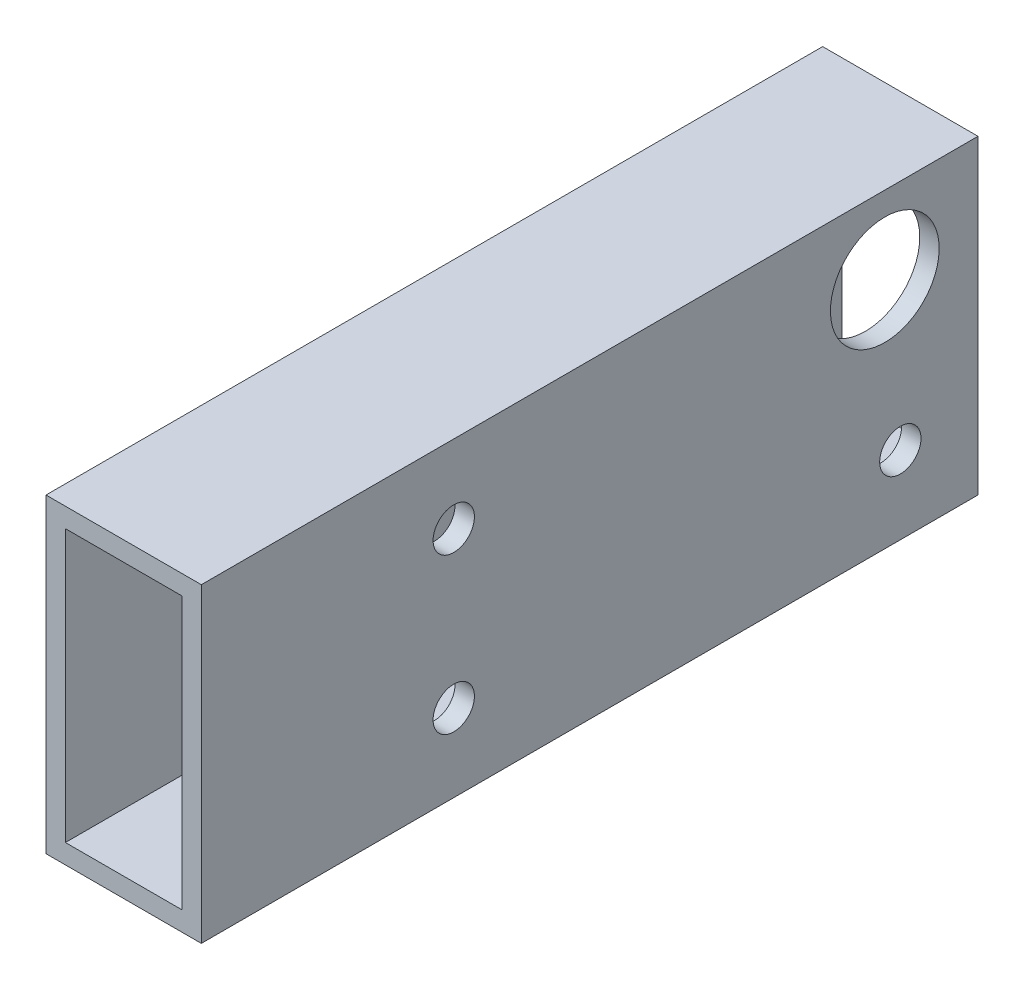
ISO-10303-21;
HEADER;
FILE_DESCRIPTION(('STEP AP214'),'2;1');
FILE_NAME('part.step','',(''),(''),'','','');
FILE_SCHEMA(('AUTOMOTIVE_DESIGN { 1 0 10303 214 1 1 1 1 }'));
ENDSEC;
DATA;
#1=APPLICATION_CONTEXT('core data for automotive mechanical design processes');
#2=APPLICATION_PROTOCOL_DEFINITION('international standard','automotive_design',2000,#1);
#3=PRODUCT_CONTEXT('',#1,'mechanical');
#4=PRODUCT('Part','Part','',(#3));
#5=PRODUCT_RELATED_PRODUCT_CATEGORY('part','',(#4));
#6=PRODUCT_DEFINITION_FORMATION('','',#4);
#7=PRODUCT_DEFINITION_CONTEXT('part definition',#1,'design');
#8=PRODUCT_DEFINITION('design','',#6,#7);
#9=PRODUCT_DEFINITION_SHAPE('','',#8);
#10=(LENGTH_UNIT() NAMED_UNIT(*) SI_UNIT(.MILLI.,.METRE.));
#11=(NAMED_UNIT(*) PLANE_ANGLE_UNIT() SI_UNIT($,.RADIAN.));
#12=(NAMED_UNIT(*) SI_UNIT($,.STERADIAN.) SOLID_ANGLE_UNIT());
#13=UNCERTAINTY_MEASURE_WITH_UNIT(LENGTH_MEASURE(1.E-05),#10,'distance_accuracy_value','');
#14=(GEOMETRIC_REPRESENTATION_CONTEXT(3) GLOBAL_UNCERTAINTY_ASSIGNED_CONTEXT((#13)) GLOBAL_UNIT_ASSIGNED_CONTEXT((#10,
#11,#12)) REPRESENTATION_CONTEXT('',''));
#15=CARTESIAN_POINT('',(0.,0.,0.));
#16=DIRECTION('',(0.,0.,1.));
#17=DIRECTION('',(1.,0.,0.));
#18=AXIS2_PLACEMENT_3D('',#15,#16,#17);
#19=CARTESIAN_POINT('',(0.,0.,63.5));
#20=DIRECTION('',(0.,0.,1.));
#21=DIRECTION('',(1.,0.,0.));
#22=AXIS2_PLACEMENT_3D('',#19,#20,#21);
#23=PLANE('',#22);
#24=DIRECTION('',(0.,1.,0.));
#25=VECTOR('',#24,1.);
#26=CARTESIAN_POINT('',(12.7,25.4,63.5));
#27=LINE('',#26,#25);
#28=CARTESIAN_POINT('',(12.7,-25.4,63.5));
#29=VERTEX_POINT('',#28);
#30=CARTESIAN_POINT('',(12.7,25.4,63.5));
#31=VERTEX_POINT('',#30);
#32=EDGE_CURVE('E137',#29,#31,#27,.T.);
#33=ORIENTED_EDGE('',*,*,#32,.T.);
#34=DIRECTION('',(-1.,0.,0.));
#35=VECTOR('',#34,1.);
#36=CARTESIAN_POINT('',(-12.7,25.4,63.5));
#37=LINE('',#36,#35);
#38=CARTESIAN_POINT('',(-12.7,25.4,63.5));
#39=VERTEX_POINT('',#38);
#40=EDGE_CURVE('E140',#31,#39,#37,.T.);
#41=ORIENTED_EDGE('',*,*,#40,.T.);
#42=DIRECTION('',(0.,-1.,0.));
#43=VECTOR('',#42,1.);
#44=CARTESIAN_POINT('',(-12.7,25.4,63.5));
#45=LINE('',#44,#43);
#46=CARTESIAN_POINT('',(-12.7,-25.4,63.5));
#47=VERTEX_POINT('',#46);
#48=EDGE_CURVE('E143',#39,#47,#45,.T.);
#49=ORIENTED_EDGE('',*,*,#48,.T.);
#50=DIRECTION('',(1.,0.,0.));
#51=VECTOR('',#50,1.);
#52=CARTESIAN_POINT('',(-12.7,-25.4,63.5));
#53=LINE('',#52,#51);
#54=EDGE_CURVE('E145',#47,#29,#53,.T.);
#55=ORIENTED_EDGE('',*,*,#54,.T.);
#56=EDGE_LOOP('',(#33,#41,#49,#55));
#57=FACE_BOUND('',#56,.T.);
#58=DIRECTION('',(1.,0.,0.));
#59=VECTOR('',#58,1.);
#60=CARTESIAN_POINT('',(-9.525,-22.225,63.5));
#61=LINE('',#60,#59);
#62=CARTESIAN_POINT('',(-9.525,-22.225,63.5));
#63=VERTEX_POINT('',#62);
#64=CARTESIAN_POINT('',(9.52500000000001,-22.225,63.5));
#65=VERTEX_POINT('',#64);
#66=EDGE_CURVE('E107',#63,#65,#61,.T.);
#67=ORIENTED_EDGE('',*,*,#66,.F.);
#68=DIRECTION('',(0.,-1.,0.));
#69=VECTOR('',#68,1.);
#70=CARTESIAN_POINT('',(-9.525,22.225,63.5));
#71=LINE('',#70,#69);
#72=CARTESIAN_POINT('',(-9.525,22.225,63.5));
#73=VERTEX_POINT('',#72);
#74=EDGE_CURVE('E99',#73,#63,#71,.T.);
#75=ORIENTED_EDGE('',*,*,#74,.F.);
#76=DIRECTION('',(-1.,0.,0.));
#77=VECTOR('',#76,1.);
#78=CARTESIAN_POINT('',(-9.525,22.225,63.5));
#79=LINE('',#78,#77);
#80=CARTESIAN_POINT('',(9.525,22.225,63.5));
#81=VERTEX_POINT('',#80);
#82=EDGE_CURVE('E121',#81,#73,#79,.T.);
#83=ORIENTED_EDGE('',*,*,#82,.F.);
#84=DIRECTION('',(0.,1.,0.));
#85=VECTOR('',#84,1.);
#86=CARTESIAN_POINT('',(9.525,22.225,63.5));
#87=LINE('',#86,#85);
#88=EDGE_CURVE('E119',#65,#81,#87,.T.);
#89=ORIENTED_EDGE('',*,*,#88,.F.);
#90=EDGE_LOOP('',(#67,#75,#83,#89));
#91=FACE_BOUND('',#90,.T.);
#92=ADVANCED_FACE('F32',(#57,#91),#23,.T.);
#93=CARTESIAN_POINT('',(0.,0.,-63.5));
#94=DIRECTION('',(0.,0.,1.));
#95=DIRECTION('',(1.,0.,0.));
#96=AXIS2_PLACEMENT_3D('',#93,#94,#95);
#97=PLANE('',#96);
#98=DIRECTION('',(0.,1.,0.));
#99=VECTOR('',#98,1.);
#100=CARTESIAN_POINT('',(12.7,25.4,-63.5));
#101=LINE('',#100,#99);
#102=CARTESIAN_POINT('',(12.7,-25.4,-63.5));
#103=VERTEX_POINT('',#102);
#104=CARTESIAN_POINT('',(12.7,25.4,-63.5));
#105=VERTEX_POINT('',#104);
#106=EDGE_CURVE('E115',#103,#105,#101,.T.);
#107=ORIENTED_EDGE('',*,*,#106,.F.);
#108=DIRECTION('',(1.,0.,0.));
#109=VECTOR('',#108,1.);
#110=CARTESIAN_POINT('',(-12.7,-25.4,-63.5));
#111=LINE('',#110,#109);
#112=CARTESIAN_POINT('',(-12.7,-25.4,-63.5));
#113=VERTEX_POINT('',#112);
#114=EDGE_CURVE('E141',#113,#103,#111,.T.);
#115=ORIENTED_EDGE('',*,*,#114,.F.);
#116=DIRECTION('',(0.,-1.,0.));
#117=VECTOR('',#116,1.);
#118=CARTESIAN_POINT('',(-12.7,25.4,-63.5));
#119=LINE('',#118,#117);
#120=CARTESIAN_POINT('',(-12.7,25.4,-63.5));
#121=VERTEX_POINT('',#120);
#122=EDGE_CURVE('E152',#121,#113,#119,.T.);
#123=ORIENTED_EDGE('',*,*,#122,.F.);
#124=DIRECTION('',(-1.,0.,0.));
#125=VECTOR('',#124,1.);
#126=CARTESIAN_POINT('',(-12.7,25.4,-63.5));
#127=LINE('',#126,#125);
#128=EDGE_CURVE('E150',#105,#121,#127,.T.);
#129=ORIENTED_EDGE('',*,*,#128,.F.);
#130=EDGE_LOOP('',(#107,#115,#123,#129));
#131=FACE_BOUND('',#130,.T.);
#132=DIRECTION('',(0.,-1.,0.));
#133=VECTOR('',#132,1.);
#134=CARTESIAN_POINT('',(-9.525,22.225,-63.5));
#135=LINE('',#134,#133);
#136=CARTESIAN_POINT('',(-9.525,22.225,-63.5));
#137=VERTEX_POINT('',#136);
#138=CARTESIAN_POINT('',(-9.525,-22.225,-63.5));
#139=VERTEX_POINT('',#138);
#140=EDGE_CURVE('E57',#137,#139,#135,.T.);
#141=ORIENTED_EDGE('',*,*,#140,.T.);
#142=DIRECTION('',(1.,0.,0.));
#143=VECTOR('',#142,1.);
#144=CARTESIAN_POINT('',(-9.525,-22.225,-63.5));
#145=LINE('',#144,#143);
#146=CARTESIAN_POINT('',(9.52500000000001,-22.225,-63.5));
#147=VERTEX_POINT('',#146);
#148=EDGE_CURVE('E114',#139,#147,#145,.T.);
#149=ORIENTED_EDGE('',*,*,#148,.T.);
#150=DIRECTION('',(0.,1.,0.));
#151=VECTOR('',#150,1.);
#152=CARTESIAN_POINT('',(9.525,22.225,-63.5));
#153=LINE('',#152,#151);
#154=CARTESIAN_POINT('',(9.525,22.225,-63.5));
#155=VERTEX_POINT('',#154);
#156=EDGE_CURVE('E129',#147,#155,#153,.T.);
#157=ORIENTED_EDGE('',*,*,#156,.T.);
#158=DIRECTION('',(-1.,0.,0.));
#159=VECTOR('',#158,1.);
#160=CARTESIAN_POINT('',(-9.525,22.225,-63.5));
#161=LINE('',#160,#159);
#162=EDGE_CURVE('E108',#155,#137,#161,.T.);
#163=ORIENTED_EDGE('',*,*,#162,.T.);
#164=EDGE_LOOP('',(#141,#149,#157,#163));
#165=FACE_BOUND('',#164,.T.);
#166=ADVANCED_FACE('F223',(#131,#165),#97,.F.);
#167=CARTESIAN_POINT('',(12.7,25.4,63.5));
#168=DIRECTION('',(-1.,0.,0.));
#169=DIRECTION('',(0.,-1.,0.));
#170=AXIS2_PLACEMENT_3D('',#167,#168,#169);
#171=PLANE('',#170);
#172=CARTESIAN_POINT('',(12.7,12.7,-48.26));
#173=DIRECTION('',(1.,0.,0.));
#174=DIRECTION('',(0.,1.,0.));
#175=AXIS2_PLACEMENT_3D('',#172,#173,#174);
#176=CIRCLE('',#175,8.88999999999999);
#177=CARTESIAN_POINT('',(12.7,21.59,-48.26));
#178=VERTEX_POINT('',#177);
#179=EDGE_CURVE('E291',#178,#178,#176,.T.);
#180=ORIENTED_EDGE('',*,*,#179,.F.);
#181=EDGE_LOOP('',(#180));
#182=FACE_BOUND('',#181,.T.);
#183=CARTESIAN_POINT('',(12.7,-12.7,-50.8));
#184=DIRECTION('',(1.,0.,0.));
#185=DIRECTION('',(0.,1.,0.));
#186=AXIS2_PLACEMENT_3D('',#183,#184,#185);
#187=CIRCLE('',#186,3.3782);
#188=CARTESIAN_POINT('',(12.7,-9.32180000000001,-50.8));
#189=VERTEX_POINT('',#188);
#190=EDGE_CURVE('E180',#189,#189,#187,.T.);
#191=ORIENTED_EDGE('',*,*,#190,.F.);
#192=EDGE_LOOP('',(#191));
#193=FACE_BOUND('',#192,.T.);
#194=CARTESIAN_POINT('',(12.7,-12.7,22.225));
#195=DIRECTION('',(1.,0.,0.));
#196=DIRECTION('',(0.,1.,0.));
#197=AXIS2_PLACEMENT_3D('',#194,#195,#196);
#198=CIRCLE('',#197,3.3782);
#199=CARTESIAN_POINT('',(12.7,-9.32180000000001,22.225));
#200=VERTEX_POINT('',#199);
#201=EDGE_CURVE('E177',#200,#200,#198,.T.);
#202=ORIENTED_EDGE('',*,*,#201,.F.);
#203=EDGE_LOOP('',(#202));
#204=FACE_BOUND('',#203,.T.);
#205=CARTESIAN_POINT('',(12.7,12.7,22.225));
#206=DIRECTION('',(1.,0.,0.));
#207=DIRECTION('',(0.,1.,0.));
#208=AXIS2_PLACEMENT_3D('',#205,#206,#207);
#209=CIRCLE('',#208,3.3782);
#210=CARTESIAN_POINT('',(12.7,16.0782,22.225));
#211=VERTEX_POINT('',#210);
#212=EDGE_CURVE('E196',#211,#211,#209,.T.);
#213=ORIENTED_EDGE('',*,*,#212,.F.);
#214=EDGE_LOOP('',(#213));
#215=FACE_BOUND('',#214,.T.);
#216=ORIENTED_EDGE('',*,*,#106,.T.);
#217=DIRECTION('',(0.,0.,-1.));
#218=VECTOR('',#217,1.);
#219=CARTESIAN_POINT('',(12.7,25.4,63.5));
#220=LINE('',#219,#218);
#221=EDGE_CURVE('E11',#31,#105,#220,.T.);
#222=ORIENTED_EDGE('',*,*,#221,.F.);
#223=ORIENTED_EDGE('',*,*,#32,.F.);
#224=DIRECTION('',(0.,0.,-1.));
#225=VECTOR('',#224,1.);
#226=CARTESIAN_POINT('',(12.7,-25.4,63.5));
#227=LINE('',#226,#225);
#228=EDGE_CURVE('E147',#29,#103,#227,.T.);
#229=ORIENTED_EDGE('',*,*,#228,.T.);
#230=EDGE_LOOP('',(#216,#222,#223,#229));
#231=FACE_BOUND('',#230,.T.);
#232=ADVANCED_FACE('F34',(#182,#193,#204,#215,#231),#171,.F.);
#233=CARTESIAN_POINT('',(-12.7,25.4,63.5));
#234=DIRECTION('',(0.,-1.,0.));
#235=DIRECTION('',(0.,0.,-1.));
#236=AXIS2_PLACEMENT_3D('',#233,#234,#235);
#237=PLANE('',#236);
#238=ORIENTED_EDGE('',*,*,#128,.T.);
#239=DIRECTION('',(0.,0.,-1.));
#240=VECTOR('',#239,1.);
#241=CARTESIAN_POINT('',(-12.7,25.4,63.5));
#242=LINE('',#241,#240);
#243=EDGE_CURVE('E41',#39,#121,#242,.T.);
#244=ORIENTED_EDGE('',*,*,#243,.F.);
#245=ORIENTED_EDGE('',*,*,#40,.F.);
#246=ORIENTED_EDGE('',*,*,#221,.T.);
#247=EDGE_LOOP('',(#238,#244,#245,#246));
#248=FACE_BOUND('',#247,.T.);
#249=ADVANCED_FACE('F232',(#248),#237,.F.);
#250=CARTESIAN_POINT('',(-12.7,25.4,63.5));
#251=DIRECTION('',(1.,0.,0.));
#252=DIRECTION('',(0.,1.,0.));
#253=AXIS2_PLACEMENT_3D('',#250,#251,#252);
#254=PLANE('',#253);
#255=CARTESIAN_POINT('',(-12.7,12.7,-48.26));
#256=DIRECTION('',(1.,0.,0.));
#257=DIRECTION('',(0.,1.,0.));
#258=AXIS2_PLACEMENT_3D('',#255,#256,#257);
#259=CIRCLE('',#258,8.88999999999999);
#260=CARTESIAN_POINT('',(-12.7,21.59,-48.26));
#261=VERTEX_POINT('',#260);
#262=EDGE_CURVE('E292',#261,#261,#259,.T.);
#263=ORIENTED_EDGE('',*,*,#262,.T.);
#264=EDGE_LOOP('',(#263));
#265=FACE_BOUND('',#264,.T.);
#266=CARTESIAN_POINT('',(-12.7,-12.7,-50.8));
#267=DIRECTION('',(1.,0.,0.));
#268=DIRECTION('',(0.,1.,0.));
#269=AXIS2_PLACEMENT_3D('',#266,#267,#268);
#270=CIRCLE('',#269,3.3782);
#271=CARTESIAN_POINT('',(-12.7,-9.32180000000001,-50.8));
#272=VERTEX_POINT('',#271);
#273=EDGE_CURVE('E173',#272,#272,#270,.T.);
#274=ORIENTED_EDGE('',*,*,#273,.T.);
#275=EDGE_LOOP('',(#274));
#276=FACE_BOUND('',#275,.T.);
#277=CARTESIAN_POINT('',(-12.7,-12.7,22.225));
#278=DIRECTION('',(1.,0.,0.));
#279=DIRECTION('',(0.,1.,0.));
#280=AXIS2_PLACEMENT_3D('',#277,#278,#279);
#281=CIRCLE('',#280,3.3782);
#282=CARTESIAN_POINT('',(-12.7,-9.32180000000001,22.225));
#283=VERTEX_POINT('',#282);
#284=EDGE_CURVE('E169',#283,#283,#281,.T.);
#285=ORIENTED_EDGE('',*,*,#284,.T.);
#286=EDGE_LOOP('',(#285));
#287=FACE_BOUND('',#286,.T.);
#288=CARTESIAN_POINT('',(-12.7,12.7,22.225));
#289=DIRECTION('',(1.,0.,0.));
#290=DIRECTION('',(0.,1.,0.));
#291=AXIS2_PLACEMENT_3D('',#288,#289,#290);
#292=CIRCLE('',#291,3.3782);
#293=CARTESIAN_POINT('',(-12.7,16.0782,22.225));
#294=VERTEX_POINT('',#293);
#295=EDGE_CURVE('E165',#294,#294,#292,.T.);
#296=ORIENTED_EDGE('',*,*,#295,.T.);
#297=EDGE_LOOP('',(#296));
#298=FACE_BOUND('',#297,.T.);
#299=ORIENTED_EDGE('',*,*,#122,.T.);
#300=DIRECTION('',(0.,0.,-1.));
#301=VECTOR('',#300,1.);
#302=CARTESIAN_POINT('',(-12.7,-25.4,63.5));
#303=LINE('',#302,#301);
#304=EDGE_CURVE('E157',#47,#113,#303,.T.);
#305=ORIENTED_EDGE('',*,*,#304,.F.);
#306=ORIENTED_EDGE('',*,*,#48,.F.);
#307=ORIENTED_EDGE('',*,*,#243,.T.);
#308=EDGE_LOOP('',(#299,#305,#306,#307));
#309=FACE_BOUND('',#308,.T.);
#310=ADVANCED_FACE('F216',(#265,#276,#287,#298,#309),#254,.F.);
#311=CARTESIAN_POINT('',(-12.7,-25.4,63.5));
#312=DIRECTION('',(0.,1.,0.));
#313=DIRECTION('',(0.,0.,1.));
#314=AXIS2_PLACEMENT_3D('',#311,#312,#313);
#315=PLANE('',#314);
#316=ORIENTED_EDGE('',*,*,#114,.T.);
#317=ORIENTED_EDGE('',*,*,#228,.F.);
#318=ORIENTED_EDGE('',*,*,#54,.F.);
#319=ORIENTED_EDGE('',*,*,#304,.T.);
#320=EDGE_LOOP('',(#316,#317,#318,#319));
#321=FACE_BOUND('',#320,.T.);
#322=ADVANCED_FACE('F207',(#321),#315,.F.);
#323=CARTESIAN_POINT('',(-9.525,22.225,63.5));
#324=DIRECTION('',(1.,0.,0.));
#325=DIRECTION('',(0.,1.,0.));
#326=AXIS2_PLACEMENT_3D('',#323,#324,#325);
#327=PLANE('',#326);
#328=CARTESIAN_POINT('',(-9.525,12.7,-48.26));
#329=DIRECTION('',(1.,0.,0.));
#330=DIRECTION('',(0.,1.,0.));
#331=AXIS2_PLACEMENT_3D('',#328,#329,#330);
#332=CIRCLE('',#331,8.88999999999999);
#333=CARTESIAN_POINT('',(-9.525,21.59,-48.26));
#334=VERTEX_POINT('',#333);
#335=EDGE_CURVE('E185',#334,#334,#332,.T.);
#336=ORIENTED_EDGE('',*,*,#335,.F.);
#337=EDGE_LOOP('',(#336));
#338=FACE_BOUND('',#337,.T.);
#339=CARTESIAN_POINT('',(-9.525,-12.7,-50.8));
#340=DIRECTION('',(1.,0.,0.));
#341=DIRECTION('',(0.,1.,0.));
#342=AXIS2_PLACEMENT_3D('',#339,#340,#341);
#343=CIRCLE('',#342,3.3782);
#344=CARTESIAN_POINT('',(-9.525,-9.32180000000001,-50.8));
#345=VERTEX_POINT('',#344);
#346=EDGE_CURVE('E172',#345,#345,#343,.T.);
#347=ORIENTED_EDGE('',*,*,#346,.F.);
#348=EDGE_LOOP('',(#347));
#349=FACE_BOUND('',#348,.T.);
#350=CARTESIAN_POINT('',(-9.525,-12.7,22.225));
#351=DIRECTION('',(1.,0.,0.));
#352=DIRECTION('',(0.,1.,0.));
#353=AXIS2_PLACEMENT_3D('',#350,#351,#352);
#354=CIRCLE('',#353,3.3782);
#355=CARTESIAN_POINT('',(-9.525,-9.32180000000001,22.225));
#356=VERTEX_POINT('',#355);
#357=EDGE_CURVE('E168',#356,#356,#354,.T.);
#358=ORIENTED_EDGE('',*,*,#357,.F.);
#359=EDGE_LOOP('',(#358));
#360=FACE_BOUND('',#359,.T.);
#361=CARTESIAN_POINT('',(-9.525,12.7,22.225));
#362=DIRECTION('',(1.,0.,0.));
#363=DIRECTION('',(0.,1.,0.));
#364=AXIS2_PLACEMENT_3D('',#361,#362,#363);
#365=CIRCLE('',#364,3.3782);
#366=CARTESIAN_POINT('',(-9.525,16.0782,22.225));
#367=VERTEX_POINT('',#366);
#368=EDGE_CURVE('E127',#367,#367,#365,.T.);
#369=ORIENTED_EDGE('',*,*,#368,.F.);
#370=EDGE_LOOP('',(#369));
#371=FACE_BOUND('',#370,.T.);
#372=ORIENTED_EDGE('',*,*,#140,.F.);
#373=DIRECTION('',(0.,0.,-1.));
#374=VECTOR('',#373,1.);
#375=CARTESIAN_POINT('',(-9.525,22.225,63.5));
#376=LINE('',#375,#374);
#377=EDGE_CURVE('E103',#73,#137,#376,.T.);
#378=ORIENTED_EDGE('',*,*,#377,.F.);
#379=ORIENTED_EDGE('',*,*,#74,.T.);
#380=DIRECTION('',(0.,0.,-1.));
#381=VECTOR('',#380,1.);
#382=CARTESIAN_POINT('',(-9.525,-22.225,63.5));
#383=LINE('',#382,#381);
#384=EDGE_CURVE('E102',#63,#139,#383,.T.);
#385=ORIENTED_EDGE('',*,*,#384,.T.);
#386=EDGE_LOOP('',(#372,#378,#379,#385));
#387=FACE_BOUND('',#386,.T.);
#388=ADVANCED_FACE('F101',(#338,#349,#360,#371,#387),#327,.T.);
#389=CARTESIAN_POINT('',(-9.525,-22.225,63.5));
#390=DIRECTION('',(0.,1.,0.));
#391=DIRECTION('',(-1.,0.,0.));
#392=AXIS2_PLACEMENT_3D('',#389,#390,#391);
#393=PLANE('',#392);
#394=ORIENTED_EDGE('',*,*,#148,.F.);
#395=ORIENTED_EDGE('',*,*,#384,.F.);
#396=ORIENTED_EDGE('',*,*,#66,.T.);
#397=DIRECTION('',(0.,0.,-1.));
#398=VECTOR('',#397,1.);
#399=CARTESIAN_POINT('',(9.52500000000001,-22.225,63.5));
#400=LINE('',#399,#398);
#401=EDGE_CURVE('E116',#65,#147,#400,.T.);
#402=ORIENTED_EDGE('',*,*,#401,.T.);
#403=EDGE_LOOP('',(#394,#395,#396,#402));
#404=FACE_BOUND('',#403,.T.);
#405=ADVANCED_FACE('F111',(#404),#393,.T.);
#406=CARTESIAN_POINT('',(9.525,22.225,63.5));
#407=DIRECTION('',(-1.,0.,0.));
#408=DIRECTION('',(0.,-1.,0.));
#409=AXIS2_PLACEMENT_3D('',#406,#407,#408);
#410=PLANE('',#409);
#411=CARTESIAN_POINT('',(9.525,12.7,-48.26));
#412=DIRECTION('',(-1.,0.,0.));
#413=DIRECTION('',(0.,-1.,0.));
#414=AXIS2_PLACEMENT_3D('',#411,#412,#413);
#415=CIRCLE('',#414,8.88999999999999);
#416=CARTESIAN_POINT('',(9.525,3.81000000000001,-48.26));
#417=VERTEX_POINT('',#416);
#418=EDGE_CURVE('E36',#417,#417,#415,.T.);
#419=ORIENTED_EDGE('',*,*,#418,.F.);
#420=EDGE_LOOP('',(#419));
#421=FACE_BOUND('',#420,.T.);
#422=CARTESIAN_POINT('',(9.525,-12.7,-50.8));
#423=DIRECTION('',(-1.,0.,0.));
#424=DIRECTION('',(0.,-1.,0.));
#425=AXIS2_PLACEMENT_3D('',#422,#423,#424);
#426=CIRCLE('',#425,3.3782);
#427=CARTESIAN_POINT('',(9.525,-16.0782,-50.8));
#428=VERTEX_POINT('',#427);
#429=EDGE_CURVE('E170',#428,#428,#426,.T.);
#430=ORIENTED_EDGE('',*,*,#429,.F.);
#431=EDGE_LOOP('',(#430));
#432=FACE_BOUND('',#431,.T.);
#433=CARTESIAN_POINT('',(9.525,-12.7,22.225));
#434=DIRECTION('',(-1.,0.,0.));
#435=DIRECTION('',(0.,-1.,0.));
#436=AXIS2_PLACEMENT_3D('',#433,#434,#435);
#437=CIRCLE('',#436,3.3782);
#438=CARTESIAN_POINT('',(9.525,-16.0782,22.225));
#439=VERTEX_POINT('',#438);
#440=EDGE_CURVE('E166',#439,#439,#437,.T.);
#441=ORIENTED_EDGE('',*,*,#440,.F.);
#442=EDGE_LOOP('',(#441));
#443=FACE_BOUND('',#442,.T.);
#444=CARTESIAN_POINT('',(9.525,12.7,22.225));
#445=DIRECTION('',(-1.,0.,0.));
#446=DIRECTION('',(0.,-1.,0.));
#447=AXIS2_PLACEMENT_3D('',#444,#445,#446);
#448=CIRCLE('',#447,3.3782);
#449=CARTESIAN_POINT('',(9.525,9.32179999999999,22.225));
#450=VERTEX_POINT('',#449);
#451=EDGE_CURVE('E162',#450,#450,#448,.T.);
#452=ORIENTED_EDGE('',*,*,#451,.F.);
#453=EDGE_LOOP('',(#452));
#454=FACE_BOUND('',#453,.T.);
#455=ORIENTED_EDGE('',*,*,#156,.F.);
#456=ORIENTED_EDGE('',*,*,#401,.F.);
#457=ORIENTED_EDGE('',*,*,#88,.T.);
#458=DIRECTION('',(0.,0.,-1.));
#459=VECTOR('',#458,1.);
#460=CARTESIAN_POINT('',(9.525,22.225,63.5));
#461=LINE('',#460,#459);
#462=EDGE_CURVE('E49',#81,#155,#461,.T.);
#463=ORIENTED_EDGE('',*,*,#462,.T.);
#464=EDGE_LOOP('',(#455,#456,#457,#463));
#465=FACE_BOUND('',#464,.T.);
#466=ADVANCED_FACE('F214',(#421,#432,#443,#454,#465),#410,.T.);
#467=CARTESIAN_POINT('',(-9.525,22.225,63.5));
#468=DIRECTION('',(0.,-1.,0.));
#469=DIRECTION('',(0.,0.,-1.));
#470=AXIS2_PLACEMENT_3D('',#467,#468,#469);
#471=PLANE('',#470);
#472=ORIENTED_EDGE('',*,*,#162,.F.);
#473=ORIENTED_EDGE('',*,*,#462,.F.);
#474=ORIENTED_EDGE('',*,*,#82,.T.);
#475=ORIENTED_EDGE('',*,*,#377,.T.);
#476=EDGE_LOOP('',(#472,#473,#474,#475));
#477=FACE_BOUND('',#476,.T.);
#478=ADVANCED_FACE('F254',(#477),#471,.T.);
#479=CARTESIAN_POINT('',(-12.7,12.7,22.225));
#480=DIRECTION('',(1.,0.,0.));
#481=DIRECTION('',(0.,1.,0.));
#482=AXIS2_PLACEMENT_3D('',#479,#480,#481);
#483=CYLINDRICAL_SURFACE('',#482,3.3782);
#484=ORIENTED_EDGE('',*,*,#451,.T.);
#485=EDGE_LOOP('',(#484));
#486=FACE_BOUND('',#485,.T.);
#487=ORIENTED_EDGE('',*,*,#212,.T.);
#488=EDGE_LOOP('',(#487));
#489=FACE_BOUND('',#488,.T.);
#490=ADVANCED_FACE('F256',(#486,#489),#483,.F.);
#491=ORIENTED_EDGE('',*,*,#368,.T.);
#492=EDGE_LOOP('',(#491));
#493=FACE_BOUND('',#492,.T.);
#494=ORIENTED_EDGE('',*,*,#295,.F.);
#495=EDGE_LOOP('',(#494));
#496=FACE_BOUND('',#495,.T.);
#497=ADVANCED_FACE('F203',(#493,#496),#483,.F.);
#498=CARTESIAN_POINT('',(-12.7,-12.7,22.225));
#499=DIRECTION('',(1.,0.,0.));
#500=DIRECTION('',(0.,1.,0.));
#501=AXIS2_PLACEMENT_3D('',#498,#499,#500);
#502=CYLINDRICAL_SURFACE('',#501,3.3782);
#503=ORIENTED_EDGE('',*,*,#440,.T.);
#504=EDGE_LOOP('',(#503));
#505=FACE_BOUND('',#504,.T.);
#506=ORIENTED_EDGE('',*,*,#201,.T.);
#507=EDGE_LOOP('',(#506));
#508=FACE_BOUND('',#507,.T.);
#509=ADVANCED_FACE('F267',(#505,#508),#502,.F.);
#510=ORIENTED_EDGE('',*,*,#357,.T.);
#511=EDGE_LOOP('',(#510));
#512=FACE_BOUND('',#511,.T.);
#513=ORIENTED_EDGE('',*,*,#284,.F.);
#514=EDGE_LOOP('',(#513));
#515=FACE_BOUND('',#514,.T.);
#516=ADVANCED_FACE('F270',(#512,#515),#502,.F.);
#517=CARTESIAN_POINT('',(-12.7,-12.7,-50.8));
#518=DIRECTION('',(1.,0.,0.));
#519=DIRECTION('',(0.,1.,0.));
#520=AXIS2_PLACEMENT_3D('',#517,#518,#519);
#521=CYLINDRICAL_SURFACE('',#520,3.3782);
#522=ORIENTED_EDGE('',*,*,#429,.T.);
#523=EDGE_LOOP('',(#522));
#524=FACE_BOUND('',#523,.T.);
#525=ORIENTED_EDGE('',*,*,#190,.T.);
#526=EDGE_LOOP('',(#525));
#527=FACE_BOUND('',#526,.T.);
#528=ADVANCED_FACE('F272',(#524,#527),#521,.F.);
#529=ORIENTED_EDGE('',*,*,#346,.T.);
#530=EDGE_LOOP('',(#529));
#531=FACE_BOUND('',#530,.T.);
#532=ORIENTED_EDGE('',*,*,#273,.F.);
#533=EDGE_LOOP('',(#532));
#534=FACE_BOUND('',#533,.T.);
#535=ADVANCED_FACE('F275',(#531,#534),#521,.F.);
#536=CARTESIAN_POINT('',(-12.7,12.7,-48.26));
#537=DIRECTION('',(1.,0.,0.));
#538=DIRECTION('',(0.,1.,0.));
#539=AXIS2_PLACEMENT_3D('',#536,#537,#538);
#540=CYLINDRICAL_SURFACE('',#539,8.88999999999999);
#541=ORIENTED_EDGE('',*,*,#418,.T.);
#542=EDGE_LOOP('',(#541));
#543=FACE_BOUND('',#542,.T.);
#544=ORIENTED_EDGE('',*,*,#179,.T.);
#545=EDGE_LOOP('',(#544));
#546=FACE_BOUND('',#545,.T.);
#547=ADVANCED_FACE('F276',(#543,#546),#540,.F.);
#548=ORIENTED_EDGE('',*,*,#335,.T.);
#549=EDGE_LOOP('',(#548));
#550=FACE_BOUND('',#549,.T.);
#551=ORIENTED_EDGE('',*,*,#262,.F.);
#552=EDGE_LOOP('',(#551));
#553=FACE_BOUND('',#552,.T.);
#554=ADVANCED_FACE('F278',(#550,#553),#540,.F.);
#555=CLOSED_SHELL('',(#92,#166,#232,#249,#310,#322,#388,#405,#466,#478,#490,#497,#509,#516,#528,
#535,#547,#554));
#556=MANIFOLD_SOLID_BREP('B2',#555);
#557=ADVANCED_BREP_SHAPE_REPRESENTATION('',(#18,#556),#14);
#558=SHAPE_DEFINITION_REPRESENTATION(#9,#557);
ENDSEC;
END-ISO-10303-21;
